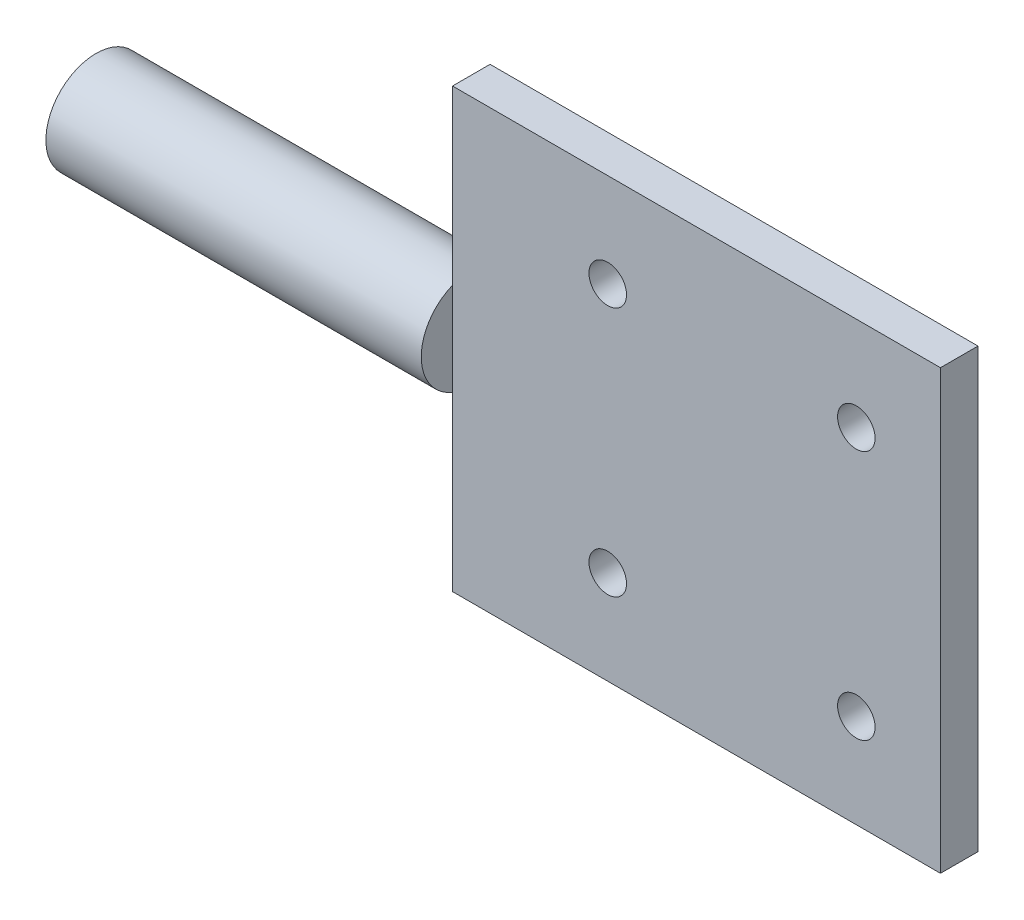
ISO-10303-21;
HEADER;
FILE_DESCRIPTION(('STEP AP214'),'2;1');
FILE_NAME('part.step','',(''),(''),'','','');
FILE_SCHEMA(('AUTOMOTIVE_DESIGN { 1 0 10303 214 1 1 1 1 }'));
ENDSEC;
DATA;
#1=APPLICATION_CONTEXT('core data for automotive mechanical design processes');
#2=APPLICATION_PROTOCOL_DEFINITION('international standard','automotive_design',2000,#1);
#3=PRODUCT_CONTEXT('',#1,'mechanical');
#4=PRODUCT('Part','Part','',(#3));
#5=PRODUCT_RELATED_PRODUCT_CATEGORY('part','',(#4));
#6=PRODUCT_DEFINITION_FORMATION('','',#4);
#7=PRODUCT_DEFINITION_CONTEXT('part definition',#1,'design');
#8=PRODUCT_DEFINITION('design','',#6,#7);
#9=PRODUCT_DEFINITION_SHAPE('','',#8);
#10=(LENGTH_UNIT() NAMED_UNIT(*) SI_UNIT(.MILLI.,.METRE.));
#11=(NAMED_UNIT(*) PLANE_ANGLE_UNIT() SI_UNIT($,.RADIAN.));
#12=(NAMED_UNIT(*) SI_UNIT($,.STERADIAN.) SOLID_ANGLE_UNIT());
#13=UNCERTAINTY_MEASURE_WITH_UNIT(LENGTH_MEASURE(1.E-05),#10,'distance_accuracy_value','');
#14=(GEOMETRIC_REPRESENTATION_CONTEXT(3) GLOBAL_UNCERTAINTY_ASSIGNED_CONTEXT((#13)) GLOBAL_UNIT_ASSIGNED_CONTEXT((#10,
#11,#12)) REPRESENTATION_CONTEXT('',''));
#15=CARTESIAN_POINT('',(0.,0.,0.));
#16=DIRECTION('',(0.,0.,1.));
#17=DIRECTION('',(1.,0.,0.));
#18=AXIS2_PLACEMENT_3D('',#15,#16,#17);
#19=CARTESIAN_POINT('',(-47.,0.,1.5));
#20=DIRECTION('',(1.,0.,0.));
#21=DIRECTION('',(0.,0.,-1.));
#22=AXIS2_PLACEMENT_3D('',#19,#20,#21);
#23=CYLINDRICAL_SURFACE('',#22,4.);
#24=CARTESIAN_POINT('',(-52.,0.,1.5));
#25=DIRECTION('',(1.,0.,0.));
#26=DIRECTION('',(0.,0.,-1.));
#27=AXIS2_PLACEMENT_3D('',#24,#25,#26);
#28=CIRCLE('',#27,4.);
#29=CARTESIAN_POINT('',(-52.,0.,-2.5));
#30=VERTEX_POINT('',#29);
#31=EDGE_CURVE('E49',#30,#30,#28,.T.);
#32=ORIENTED_EDGE('',*,*,#31,.T.);
#33=EDGE_LOOP('',(#32));
#34=FACE_BOUND('',#33,.T.);
#35=CARTESIAN_POINT('',(-22.,0.,1.5));
#36=DIRECTION('',(-1.,0.,0.));
#37=DIRECTION('',(0.,0.,1.));
#38=AXIS2_PLACEMENT_3D('',#35,#36,#37);
#39=CIRCLE('',#38,4.);
#40=CARTESIAN_POINT('',(-22.,-3.70809924354784,3.));
#41=VERTEX_POINT('',#40);
#42=CARTESIAN_POINT('',(-22.,3.70809924354783,3.));
#43=VERTEX_POINT('',#42);
#44=EDGE_CURVE('E112',#41,#43,#39,.T.);
#45=ORIENTED_EDGE('',*,*,#44,.T.);
#46=CARTESIAN_POINT('',(-22.,0.,1.5));
#47=DIRECTION('',(1.,0.,0.));
#48=DIRECTION('',(0.,0.,1.));
#49=AXIS2_PLACEMENT_3D('',#46,#47,#48);
#50=CIRCLE('',#49,4.);
#51=CARTESIAN_POINT('',(-22.,3.70809924354783,0.));
#52=VERTEX_POINT('',#51);
#53=EDGE_CURVE('E125',#52,#43,#50,.T.);
#54=ORIENTED_EDGE('',*,*,#53,.F.);
#55=CARTESIAN_POINT('',(-22.,0.,1.5));
#56=DIRECTION('',(-1.,0.,0.));
#57=DIRECTION('',(0.,0.,1.));
#58=AXIS2_PLACEMENT_3D('',#55,#56,#57);
#59=CIRCLE('',#58,4.);
#60=CARTESIAN_POINT('',(-22.,-3.70809924354784,0.));
#61=VERTEX_POINT('',#60);
#62=EDGE_CURVE('E103',#52,#61,#59,.T.);
#63=ORIENTED_EDGE('',*,*,#62,.T.);
#64=CARTESIAN_POINT('',(-22.,0.,1.5));
#65=DIRECTION('',(1.,0.,0.));
#66=DIRECTION('',(0.,0.,1.));
#67=AXIS2_PLACEMENT_3D('',#64,#65,#66);
#68=CIRCLE('',#67,4.);
#69=EDGE_CURVE('E150',#41,#61,#68,.T.);
#70=ORIENTED_EDGE('',*,*,#69,.F.);
#71=EDGE_LOOP('',(#45,#54,#63,#70));
#72=FACE_BOUND('',#71,.T.);
#73=ADVANCED_FACE('F45',(#34,#72),#23,.T.);
#74=CARTESIAN_POINT('',(0.,0.,3.));
#75=DIRECTION('',(0.,0.,1.));
#76=DIRECTION('',(1.,0.,0.));
#77=AXIS2_PLACEMENT_3D('',#74,#75,#76);
#78=PLANE('',#77);
#79=DIRECTION('',(0.,-1.,0.));
#80=VECTOR('',#79,1.);
#81=CARTESIAN_POINT('',(-22.,17.5,3.));
#82=LINE('',#81,#80);
#83=EDGE_CURVE('E113',#43,#41,#82,.T.);
#84=ORIENTED_EDGE('',*,*,#83,.T.);
#85=DIRECTION('',(0.,1.,0.));
#86=VECTOR('',#85,1.);
#87=CARTESIAN_POINT('',(-22.,-17.5,3.));
#88=LINE('',#87,#86);
#89=CARTESIAN_POINT('',(-22.,-17.5,3.));
#90=VERTEX_POINT('',#89);
#91=EDGE_CURVE('E146',#90,#41,#88,.T.);
#92=ORIENTED_EDGE('',*,*,#91,.F.);
#93=DIRECTION('',(1.,0.,0.));
#94=VECTOR('',#93,1.);
#95=CARTESIAN_POINT('',(17.,-17.5,3.));
#96=LINE('',#95,#94);
#97=CARTESIAN_POINT('',(17.,-17.5,3.));
#98=VERTEX_POINT('',#97);
#99=EDGE_CURVE('E187',#90,#98,#96,.T.);
#100=ORIENTED_EDGE('',*,*,#99,.T.);
#101=DIRECTION('',(0.,1.,0.));
#102=VECTOR('',#101,1.);
#103=CARTESIAN_POINT('',(17.,-17.5,3.));
#104=LINE('',#103,#102);
#105=CARTESIAN_POINT('',(17.,17.5,3.));
#106=VERTEX_POINT('',#105);
#107=EDGE_CURVE('E64',#98,#106,#104,.T.);
#108=ORIENTED_EDGE('',*,*,#107,.T.);
#109=DIRECTION('',(-1.,0.,0.));
#110=VECTOR('',#109,1.);
#111=CARTESIAN_POINT('',(17.,17.5,3.));
#112=LINE('',#111,#110);
#113=CARTESIAN_POINT('',(-22.,17.5,3.));
#114=VERTEX_POINT('',#113);
#115=EDGE_CURVE('E193',#106,#114,#112,.T.);
#116=ORIENTED_EDGE('',*,*,#115,.T.);
#117=DIRECTION('',(0.,1.,0.));
#118=VECTOR('',#117,1.);
#119=CARTESIAN_POINT('',(-22.,3.70809924354783,3.));
#120=LINE('',#119,#118);
#121=EDGE_CURVE('E131',#43,#114,#120,.T.);
#122=ORIENTED_EDGE('',*,*,#121,.F.);
#123=EDGE_LOOP('',(#84,#92,#100,#108,#116,#122));
#124=FACE_BOUND('',#123,.T.);
#125=CARTESIAN_POINT('',(10.2751582396487,-10.,3.));
#126=DIRECTION('',(0.,0.,1.));
#127=DIRECTION('',(1.,0.,0.));
#128=AXIS2_PLACEMENT_3D('',#125,#126,#127);
#129=CIRCLE('',#128,1.5);
#130=CARTESIAN_POINT('',(11.7751582396487,-10.,3.));
#131=VERTEX_POINT('',#130);
#132=EDGE_CURVE('E164',#131,#131,#129,.T.);
#133=ORIENTED_EDGE('',*,*,#132,.F.);
#134=EDGE_LOOP('',(#133));
#135=FACE_BOUND('',#134,.T.);
#136=CARTESIAN_POINT('',(-9.59363137479316,10.,3.));
#137=DIRECTION('',(0.,0.,1.));
#138=DIRECTION('',(1.,0.,0.));
#139=AXIS2_PLACEMENT_3D('',#136,#137,#138);
#140=CIRCLE('',#139,1.5);
#141=CARTESIAN_POINT('',(-8.09363137479316,10.,3.));
#142=VERTEX_POINT('',#141);
#143=EDGE_CURVE('E173',#142,#142,#140,.T.);
#144=ORIENTED_EDGE('',*,*,#143,.F.);
#145=EDGE_LOOP('',(#144));
#146=FACE_BOUND('',#145,.T.);
#147=CARTESIAN_POINT('',(-9.59363137479316,-10.,3.));
#148=DIRECTION('',(0.,0.,1.));
#149=DIRECTION('',(1.,0.,0.));
#150=AXIS2_PLACEMENT_3D('',#147,#148,#149);
#151=CIRCLE('',#150,1.5);
#152=CARTESIAN_POINT('',(-8.09363137479316,-10.,3.));
#153=VERTEX_POINT('',#152);
#154=EDGE_CURVE('E156',#153,#153,#151,.T.);
#155=ORIENTED_EDGE('',*,*,#154,.F.);
#156=EDGE_LOOP('',(#155));
#157=FACE_BOUND('',#156,.T.);
#158=CARTESIAN_POINT('',(10.2751582396487,10.,3.));
#159=DIRECTION('',(0.,0.,1.));
#160=DIRECTION('',(1.,0.,0.));
#161=AXIS2_PLACEMENT_3D('',#158,#159,#160);
#162=CIRCLE('',#161,1.5);
#163=CARTESIAN_POINT('',(11.7751582396487,10.,3.));
#164=VERTEX_POINT('',#163);
#165=EDGE_CURVE('E168',#164,#164,#162,.T.);
#166=ORIENTED_EDGE('',*,*,#165,.F.);
#167=EDGE_LOOP('',(#166));
#168=FACE_BOUND('',#167,.T.);
#169=ADVANCED_FACE('F212',(#124,#135,#146,#157,#168),#78,.T.);
#170=CARTESIAN_POINT('',(0.,0.,0.));
#171=DIRECTION('',(0.,0.,1.));
#172=DIRECTION('',(1.,0.,0.));
#173=AXIS2_PLACEMENT_3D('',#170,#171,#172);
#174=PLANE('',#173);
#175=CARTESIAN_POINT('',(10.2751582396487,10.,0.));
#176=DIRECTION('',(0.,0.,1.));
#177=DIRECTION('',(1.,0.,0.));
#178=AXIS2_PLACEMENT_3D('',#175,#176,#177);
#179=CIRCLE('',#178,1.5);
#180=CARTESIAN_POINT('',(11.7751582396487,10.,0.));
#181=VERTEX_POINT('',#180);
#182=EDGE_CURVE('E180',#181,#181,#179,.T.);
#183=ORIENTED_EDGE('',*,*,#182,.T.);
#184=EDGE_LOOP('',(#183));
#185=FACE_BOUND('',#184,.T.);
#186=CARTESIAN_POINT('',(-9.59363137479316,-10.,0.));
#187=DIRECTION('',(0.,0.,1.));
#188=DIRECTION('',(1.,0.,0.));
#189=AXIS2_PLACEMENT_3D('',#186,#187,#188);
#190=CIRCLE('',#189,1.5);
#191=CARTESIAN_POINT('',(-8.09363137479316,-10.,0.));
#192=VERTEX_POINT('',#191);
#193=EDGE_CURVE('E155',#192,#192,#190,.T.);
#194=ORIENTED_EDGE('',*,*,#193,.T.);
#195=EDGE_LOOP('',(#194));
#196=FACE_BOUND('',#195,.T.);
#197=CARTESIAN_POINT('',(-9.59363137479316,10.,0.));
#198=DIRECTION('',(0.,0.,1.));
#199=DIRECTION('',(1.,0.,0.));
#200=AXIS2_PLACEMENT_3D('',#197,#198,#199);
#201=CIRCLE('',#200,1.5);
#202=CARTESIAN_POINT('',(-8.09363137479316,10.,0.));
#203=VERTEX_POINT('',#202);
#204=EDGE_CURVE('E160',#203,#203,#201,.T.);
#205=ORIENTED_EDGE('',*,*,#204,.T.);
#206=EDGE_LOOP('',(#205));
#207=FACE_BOUND('',#206,.T.);
#208=CARTESIAN_POINT('',(10.2751582396487,-10.,0.));
#209=DIRECTION('',(0.,0.,1.));
#210=DIRECTION('',(1.,0.,0.));
#211=AXIS2_PLACEMENT_3D('',#208,#209,#210);
#212=CIRCLE('',#211,1.5);
#213=CARTESIAN_POINT('',(11.7751582396487,-10.,0.));
#214=VERTEX_POINT('',#213);
#215=EDGE_CURVE('E169',#214,#214,#212,.T.);
#216=ORIENTED_EDGE('',*,*,#215,.T.);
#217=EDGE_LOOP('',(#216));
#218=FACE_BOUND('',#217,.T.);
#219=DIRECTION('',(0.,1.,0.));
#220=VECTOR('',#219,1.);
#221=CARTESIAN_POINT('',(17.,-17.5,0.));
#222=LINE('',#221,#220);
#223=CARTESIAN_POINT('',(17.,-17.5,0.));
#224=VERTEX_POINT('',#223);
#225=CARTESIAN_POINT('',(17.,17.5,0.));
#226=VERTEX_POINT('',#225);
#227=EDGE_CURVE('E198',#224,#226,#222,.T.);
#228=ORIENTED_EDGE('',*,*,#227,.F.);
#229=DIRECTION('',(1.,0.,0.));
#230=VECTOR('',#229,1.);
#231=CARTESIAN_POINT('',(17.,-17.5,0.));
#232=LINE('',#231,#230);
#233=CARTESIAN_POINT('',(-22.,-17.5,0.));
#234=VERTEX_POINT('',#233);
#235=EDGE_CURVE('E75',#234,#224,#232,.T.);
#236=ORIENTED_EDGE('',*,*,#235,.F.);
#237=DIRECTION('',(0.,-1.,0.));
#238=VECTOR('',#237,1.);
#239=CARTESIAN_POINT('',(-22.,-3.70809924354784,0.));
#240=LINE('',#239,#238);
#241=EDGE_CURVE('E121',#61,#234,#240,.T.);
#242=ORIENTED_EDGE('',*,*,#241,.F.);
#243=DIRECTION('',(0.,-1.,0.));
#244=VECTOR('',#243,1.);
#245=CARTESIAN_POINT('',(-22.,17.5,0.));
#246=LINE('',#245,#244);
#247=EDGE_CURVE('E106',#52,#61,#246,.T.);
#248=ORIENTED_EDGE('',*,*,#247,.F.);
#249=DIRECTION('',(0.,-1.,0.));
#250=VECTOR('',#249,1.);
#251=CARTESIAN_POINT('',(-22.,17.5,0.));
#252=LINE('',#251,#250);
#253=CARTESIAN_POINT('',(-22.,17.5,0.));
#254=VERTEX_POINT('',#253);
#255=EDGE_CURVE('E119',#254,#52,#252,.T.);
#256=ORIENTED_EDGE('',*,*,#255,.F.);
#257=DIRECTION('',(-1.,0.,0.));
#258=VECTOR('',#257,1.);
#259=CARTESIAN_POINT('',(17.,17.5,0.));
#260=LINE('',#259,#258);
#261=EDGE_CURVE('E190',#226,#254,#260,.T.);
#262=ORIENTED_EDGE('',*,*,#261,.F.);
#263=EDGE_LOOP('',(#228,#236,#242,#248,#256,#262));
#264=FACE_BOUND('',#263,.T.);
#265=ADVANCED_FACE('F116',(#185,#196,#207,#218,#264),#174,.F.);
#266=CARTESIAN_POINT('',(17.,-17.5,3.));
#267=DIRECTION('',(0.,1.,0.));
#268=DIRECTION('',(0.,0.,1.));
#269=AXIS2_PLACEMENT_3D('',#266,#267,#268);
#270=PLANE('',#269);
#271=ORIENTED_EDGE('',*,*,#235,.T.);
#272=DIRECTION('',(0.,0.,-1.));
#273=VECTOR('',#272,1.);
#274=CARTESIAN_POINT('',(17.,-17.5,3.));
#275=LINE('',#274,#273);
#276=EDGE_CURVE('E11',#98,#224,#275,.T.);
#277=ORIENTED_EDGE('',*,*,#276,.F.);
#278=ORIENTED_EDGE('',*,*,#99,.F.);
#279=DIRECTION('',(0.,0.,1.));
#280=VECTOR('',#279,1.);
#281=CARTESIAN_POINT('',(-22.,-17.5,0.));
#282=LINE('',#281,#280);
#283=EDGE_CURVE('E139',#234,#90,#282,.T.);
#284=ORIENTED_EDGE('',*,*,#283,.F.);
#285=EDGE_LOOP('',(#271,#277,#278,#284));
#286=FACE_BOUND('',#285,.T.);
#287=ADVANCED_FACE('F47',(#286),#270,.F.);
#288=CARTESIAN_POINT('',(17.,-17.5,3.));
#289=DIRECTION('',(-1.,0.,0.));
#290=DIRECTION('',(0.,0.,1.));
#291=AXIS2_PLACEMENT_3D('',#288,#289,#290);
#292=PLANE('',#291);
#293=ORIENTED_EDGE('',*,*,#227,.T.);
#294=DIRECTION('',(0.,0.,-1.));
#295=VECTOR('',#294,1.);
#296=CARTESIAN_POINT('',(17.,17.5,3.));
#297=LINE('',#296,#295);
#298=EDGE_CURVE('E56',#106,#226,#297,.T.);
#299=ORIENTED_EDGE('',*,*,#298,.F.);
#300=ORIENTED_EDGE('',*,*,#107,.F.);
#301=ORIENTED_EDGE('',*,*,#276,.T.);
#302=EDGE_LOOP('',(#293,#299,#300,#301));
#303=FACE_BOUND('',#302,.T.);
#304=ADVANCED_FACE('F209',(#303),#292,.F.);
#305=CARTESIAN_POINT('',(17.,17.5,3.));
#306=DIRECTION('',(0.,-1.,0.));
#307=DIRECTION('',(1.,0.,0.));
#308=AXIS2_PLACEMENT_3D('',#305,#306,#307);
#309=PLANE('',#308);
#310=ORIENTED_EDGE('',*,*,#261,.T.);
#311=DIRECTION('',(0.,0.,-1.));
#312=VECTOR('',#311,1.);
#313=CARTESIAN_POINT('',(-22.,17.5,3.));
#314=LINE('',#313,#312);
#315=EDGE_CURVE('E135',#114,#254,#314,.T.);
#316=ORIENTED_EDGE('',*,*,#315,.F.);
#317=ORIENTED_EDGE('',*,*,#115,.F.);
#318=ORIENTED_EDGE('',*,*,#298,.T.);
#319=EDGE_LOOP('',(#310,#316,#317,#318));
#320=FACE_BOUND('',#319,.T.);
#321=ADVANCED_FACE('F207',(#320),#309,.F.);
#322=CARTESIAN_POINT('',(10.2751582396487,10.,0.));
#323=DIRECTION('',(0.,0.,1.));
#324=DIRECTION('',(1.,0.,0.));
#325=AXIS2_PLACEMENT_3D('',#322,#323,#324);
#326=CYLINDRICAL_SURFACE('',#325,1.5);
#327=ORIENTED_EDGE('',*,*,#182,.F.);
#328=EDGE_LOOP('',(#327));
#329=FACE_BOUND('',#328,.T.);
#330=ORIENTED_EDGE('',*,*,#165,.T.);
#331=EDGE_LOOP('',(#330));
#332=FACE_BOUND('',#331,.T.);
#333=ADVANCED_FACE('F239',(#329,#332),#326,.F.);
#334=CARTESIAN_POINT('',(-9.59363137479316,-10.,0.));
#335=DIRECTION('',(0.,0.,1.));
#336=DIRECTION('',(1.,0.,0.));
#337=AXIS2_PLACEMENT_3D('',#334,#335,#336);
#338=CYLINDRICAL_SURFACE('',#337,1.5);
#339=ORIENTED_EDGE('',*,*,#193,.F.);
#340=EDGE_LOOP('',(#339));
#341=FACE_BOUND('',#340,.T.);
#342=ORIENTED_EDGE('',*,*,#154,.T.);
#343=EDGE_LOOP('',(#342));
#344=FACE_BOUND('',#343,.T.);
#345=ADVANCED_FACE('F237',(#341,#344),#338,.F.);
#346=CARTESIAN_POINT('',(-9.59363137479316,10.,0.));
#347=DIRECTION('',(0.,0.,1.));
#348=DIRECTION('',(1.,0.,0.));
#349=AXIS2_PLACEMENT_3D('',#346,#347,#348);
#350=CYLINDRICAL_SURFACE('',#349,1.5);
#351=ORIENTED_EDGE('',*,*,#204,.F.);
#352=EDGE_LOOP('',(#351));
#353=FACE_BOUND('',#352,.T.);
#354=ORIENTED_EDGE('',*,*,#143,.T.);
#355=EDGE_LOOP('',(#354));
#356=FACE_BOUND('',#355,.T.);
#357=ADVANCED_FACE('F225',(#353,#356),#350,.F.);
#358=CARTESIAN_POINT('',(10.2751582396487,-10.,0.));
#359=DIRECTION('',(0.,0.,1.));
#360=DIRECTION('',(1.,0.,0.));
#361=AXIS2_PLACEMENT_3D('',#358,#359,#360);
#362=CYLINDRICAL_SURFACE('',#361,1.5);
#363=ORIENTED_EDGE('',*,*,#215,.F.);
#364=EDGE_LOOP('',(#363));
#365=FACE_BOUND('',#364,.T.);
#366=ORIENTED_EDGE('',*,*,#132,.T.);
#367=EDGE_LOOP('',(#366));
#368=FACE_BOUND('',#367,.T.);
#369=ADVANCED_FACE('F217',(#365,#368),#362,.F.);
#370=CARTESIAN_POINT('',(-22.,0.,1.5));
#371=DIRECTION('',(-1.,0.,0.));
#372=DIRECTION('',(0.,0.,1.));
#373=AXIS2_PLACEMENT_3D('',#370,#371,#372);
#374=PLANE('',#373);
#375=ORIENTED_EDGE('',*,*,#283,.T.);
#376=ORIENTED_EDGE('',*,*,#91,.T.);
#377=ORIENTED_EDGE('',*,*,#69,.T.);
#378=ORIENTED_EDGE('',*,*,#241,.T.);
#379=EDGE_LOOP('',(#375,#376,#377,#378));
#380=FACE_BOUND('',#379,.T.);
#381=ADVANCED_FACE('F215',(#380),#374,.T.);
#382=CARTESIAN_POINT('',(-22.,0.,1.5));
#383=DIRECTION('',(-1.,0.,0.));
#384=DIRECTION('',(0.,0.,1.));
#385=AXIS2_PLACEMENT_3D('',#382,#383,#384);
#386=PLANE('',#385);
#387=ORIENTED_EDGE('',*,*,#315,.T.);
#388=ORIENTED_EDGE('',*,*,#255,.T.);
#389=ORIENTED_EDGE('',*,*,#53,.T.);
#390=ORIENTED_EDGE('',*,*,#121,.T.);
#391=EDGE_LOOP('',(#387,#388,#389,#390));
#392=FACE_BOUND('',#391,.T.);
#393=ADVANCED_FACE('F133',(#392),#386,.T.);
#394=CARTESIAN_POINT('',(-22.,17.5,3.));
#395=DIRECTION('',(-1.,0.,0.));
#396=DIRECTION('',(0.,0.,1.));
#397=AXIS2_PLACEMENT_3D('',#394,#395,#396);
#398=PLANE('',#397);
#399=ORIENTED_EDGE('',*,*,#44,.F.);
#400=ORIENTED_EDGE('',*,*,#83,.F.);
#401=EDGE_LOOP('',(#399,#400));
#402=FACE_BOUND('',#401,.T.);
#403=ADVANCED_FACE('F223',(#402),#398,.F.);
#404=CARTESIAN_POINT('',(-22.,17.5,0.));
#405=DIRECTION('',(-1.,0.,0.));
#406=DIRECTION('',(0.,0.,1.));
#407=AXIS2_PLACEMENT_3D('',#404,#405,#406);
#408=PLANE('',#407);
#409=ORIENTED_EDGE('',*,*,#247,.T.);
#410=ORIENTED_EDGE('',*,*,#62,.F.);
#411=EDGE_LOOP('',(#409,#410));
#412=FACE_BOUND('',#411,.T.);
#413=ADVANCED_FACE('F105',(#412),#408,.F.);
#414=CARTESIAN_POINT('',(-52.,17.5,0.));
#415=DIRECTION('',(1.,0.,0.));
#416=DIRECTION('',(0.,0.,-1.));
#417=AXIS2_PLACEMENT_3D('',#414,#415,#416);
#418=PLANE('',#417);
#419=ORIENTED_EDGE('',*,*,#31,.F.);
#420=EDGE_LOOP('',(#419));
#421=FACE_BOUND('',#420,.T.);
#422=ADVANCED_FACE('F352',(#421),#418,.F.);
#423=CLOSED_SHELL('',(#73,#169,#265,#287,#304,#321,#333,#345,#357,#369,#381,#393,#403,#413,#422));
#424=MANIFOLD_SOLID_BREP('B2',#423);
#425=ADVANCED_BREP_SHAPE_REPRESENTATION('',(#18,#424),#14);
#426=SHAPE_DEFINITION_REPRESENTATION(#9,#425);
ENDSEC;
END-ISO-10303-21;
